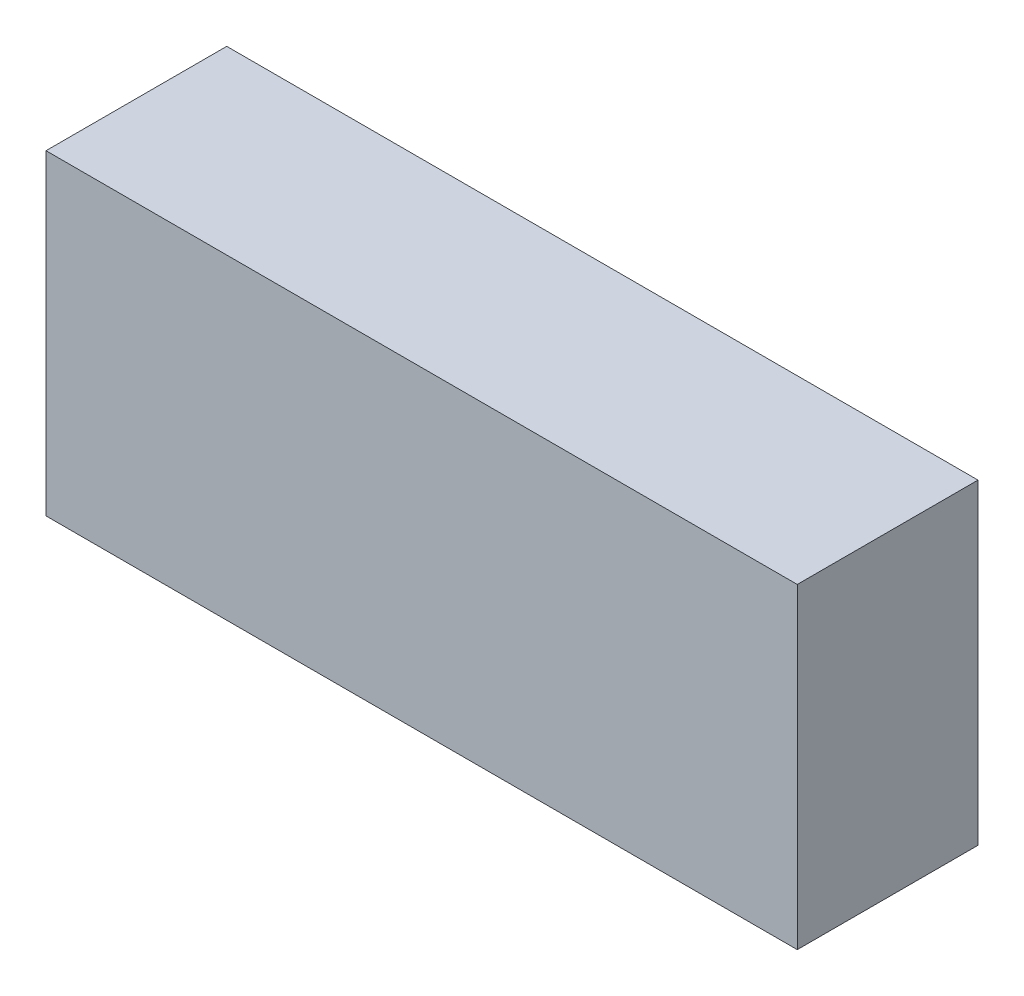
ISO-10303-21;
HEADER;
FILE_DESCRIPTION(('STEP AP214'),'2;1');
FILE_NAME('part.step','',(''),(''),'','','');
FILE_SCHEMA(('AUTOMOTIVE_DESIGN { 1 0 10303 214 1 1 1 1 }'));
ENDSEC;
DATA;
#1=APPLICATION_CONTEXT('core data for automotive mechanical design processes');
#2=APPLICATION_PROTOCOL_DEFINITION('international standard','automotive_design',2000,#1);
#3=PRODUCT_CONTEXT('',#1,'mechanical');
#4=PRODUCT('Part','Part','',(#3));
#5=PRODUCT_RELATED_PRODUCT_CATEGORY('part','',(#4));
#6=PRODUCT_DEFINITION_FORMATION('','',#4);
#7=PRODUCT_DEFINITION_CONTEXT('part definition',#1,'design');
#8=PRODUCT_DEFINITION('design','',#6,#7);
#9=PRODUCT_DEFINITION_SHAPE('','',#8);
#10=(LENGTH_UNIT() NAMED_UNIT(*) SI_UNIT(.MILLI.,.METRE.));
#11=(NAMED_UNIT(*) PLANE_ANGLE_UNIT() SI_UNIT($,.RADIAN.));
#12=(NAMED_UNIT(*) SI_UNIT($,.STERADIAN.) SOLID_ANGLE_UNIT());
#13=UNCERTAINTY_MEASURE_WITH_UNIT(LENGTH_MEASURE(1.E-05),#10,'distance_accuracy_value','');
#14=(GEOMETRIC_REPRESENTATION_CONTEXT(3) GLOBAL_UNCERTAINTY_ASSIGNED_CONTEXT((#13)) GLOBAL_UNIT_ASSIGNED_CONTEXT((#10,
#11,#12)) REPRESENTATION_CONTEXT('',''));
#15=CARTESIAN_POINT('',(0.,0.,0.));
#16=DIRECTION('',(0.,0.,1.));
#17=DIRECTION('',(1.,0.,0.));
#18=AXIS2_PLACEMENT_3D('',#15,#16,#17);
#19=CARTESIAN_POINT('',(-140.,7.,34.7899746413287));
#20=DIRECTION('',(1.,0.,0.));
#21=DIRECTION('',(0.,0.,-1.));
#22=AXIS2_PLACEMENT_3D('',#19,#20,#21);
#23=PLANE('',#22);
#24=DIRECTION('',(0.,0.,1.));
#25=VECTOR('',#24,1.);
#26=CARTESIAN_POINT('',(-140.,0.,34.7899746413287));
#27=LINE('',#26,#25);
#28=CARTESIAN_POINT('',(-140.,0.,34.7899746413287));
#29=VERTEX_POINT('',#28);
#30=CARTESIAN_POINT('',(-140.,0.,38.7899746413287));
#31=VERTEX_POINT('',#30);
#32=EDGE_CURVE('E11',#29,#31,#27,.T.);
#33=ORIENTED_EDGE('',*,*,#32,.T.);
#34=DIRECTION('',(0.,-1.,0.));
#35=VECTOR('',#34,1.);
#36=CARTESIAN_POINT('',(-140.,7.,38.7899746413287));
#37=LINE('',#36,#35);
#38=CARTESIAN_POINT('',(-140.,7.,38.7899746413287));
#39=VERTEX_POINT('',#38);
#40=EDGE_CURVE('E61',#39,#31,#37,.T.);
#41=ORIENTED_EDGE('',*,*,#40,.F.);
#42=DIRECTION('',(0.,0.,1.));
#43=VECTOR('',#42,1.);
#44=CARTESIAN_POINT('',(-140.,7.,34.7899746413287));
#45=LINE('',#44,#43);
#46=CARTESIAN_POINT('',(-140.,7.,34.7899746413287));
#47=VERTEX_POINT('',#46);
#48=EDGE_CURVE('E46',#47,#39,#45,.T.);
#49=ORIENTED_EDGE('',*,*,#48,.F.);
#50=DIRECTION('',(0.,-1.,0.));
#51=VECTOR('',#50,1.);
#52=CARTESIAN_POINT('',(-140.,7.,34.7899746413287));
#53=LINE('',#52,#51);
#54=EDGE_CURVE('E84',#47,#29,#53,.T.);
#55=ORIENTED_EDGE('',*,*,#54,.T.);
#56=EDGE_LOOP('',(#33,#41,#49,#55));
#57=FACE_BOUND('',#56,.T.);
#58=ADVANCED_FACE('F42',(#57),#23,.F.);
#59=CARTESIAN_POINT('',(-123.374044088435,7.,38.7899746413287));
#60=DIRECTION('',(0.,0.,1.));
#61=DIRECTION('',(1.,0.,0.));
#62=AXIS2_PLACEMENT_3D('',#59,#60,#61);
#63=PLANE('',#62);
#64=DIRECTION('',(-1.,0.,0.));
#65=VECTOR('',#64,1.);
#66=CARTESIAN_POINT('',(-123.374044088435,0.,38.7899746413287));
#67=LINE('',#66,#65);
#68=CARTESIAN_POINT('',(-123.374044088435,0.,38.7899746413287));
#69=VERTEX_POINT('',#68);
#70=EDGE_CURVE('E52',#69,#31,#67,.T.);
#71=ORIENTED_EDGE('',*,*,#70,.F.);
#72=DIRECTION('',(0.,-1.,0.));
#73=VECTOR('',#72,1.);
#74=CARTESIAN_POINT('',(-123.374044088435,7.,38.7899746413287));
#75=LINE('',#74,#73);
#76=CARTESIAN_POINT('',(-123.374044088435,7.,38.7899746413287));
#77=VERTEX_POINT('',#76);
#78=EDGE_CURVE('E74',#77,#69,#75,.T.);
#79=ORIENTED_EDGE('',*,*,#78,.F.);
#80=DIRECTION('',(-1.,0.,0.));
#81=VECTOR('',#80,1.);
#82=CARTESIAN_POINT('',(-123.374044088435,7.,38.7899746413287));
#83=LINE('',#82,#81);
#84=EDGE_CURVE('E108',#77,#39,#83,.T.);
#85=ORIENTED_EDGE('',*,*,#84,.T.);
#86=ORIENTED_EDGE('',*,*,#40,.T.);
#87=EDGE_LOOP('',(#71,#79,#85,#86));
#88=FACE_BOUND('',#87,.T.);
#89=ADVANCED_FACE('F114',(#88),#63,.T.);
#90=CARTESIAN_POINT('',(-123.374044088435,7.,34.7899746413287));
#91=DIRECTION('',(1.,0.,0.));
#92=DIRECTION('',(0.,0.,-1.));
#93=AXIS2_PLACEMENT_3D('',#90,#91,#92);
#94=PLANE('',#93);
#95=DIRECTION('',(0.,0.,1.));
#96=VECTOR('',#95,1.);
#97=CARTESIAN_POINT('',(-123.374044088435,0.,34.7899746413287));
#98=LINE('',#97,#96);
#99=CARTESIAN_POINT('',(-123.374044088435,0.,34.7899746413287));
#100=VERTEX_POINT('',#99);
#101=EDGE_CURVE('E101',#100,#69,#98,.T.);
#102=ORIENTED_EDGE('',*,*,#101,.F.);
#103=DIRECTION('',(0.,-1.,0.));
#104=VECTOR('',#103,1.);
#105=CARTESIAN_POINT('',(-123.374044088435,7.,34.7899746413287));
#106=LINE('',#105,#104);
#107=CARTESIAN_POINT('',(-123.374044088435,7.,34.7899746413287));
#108=VERTEX_POINT('',#107);
#109=EDGE_CURVE('E90',#108,#100,#106,.T.);
#110=ORIENTED_EDGE('',*,*,#109,.F.);
#111=DIRECTION('',(0.,0.,1.));
#112=VECTOR('',#111,1.);
#113=CARTESIAN_POINT('',(-123.374044088435,7.,34.7899746413287));
#114=LINE('',#113,#112);
#115=EDGE_CURVE('E113',#108,#77,#114,.T.);
#116=ORIENTED_EDGE('',*,*,#115,.T.);
#117=ORIENTED_EDGE('',*,*,#78,.T.);
#118=EDGE_LOOP('',(#102,#110,#116,#117));
#119=FACE_BOUND('',#118,.T.);
#120=ADVANCED_FACE('F102',(#119),#94,.T.);
#121=CARTESIAN_POINT('',(-140.,7.,34.7899746413287));
#122=DIRECTION('',(0.,0.,-1.));
#123=DIRECTION('',(-1.,0.,0.));
#124=AXIS2_PLACEMENT_3D('',#121,#122,#123);
#125=PLANE('',#124);
#126=DIRECTION('',(1.,0.,0.));
#127=VECTOR('',#126,1.);
#128=CARTESIAN_POINT('',(-140.,0.,34.7899746413287));
#129=LINE('',#128,#127);
#130=EDGE_CURVE('E94',#29,#100,#129,.T.);
#131=ORIENTED_EDGE('',*,*,#130,.F.);
#132=ORIENTED_EDGE('',*,*,#54,.F.);
#133=DIRECTION('',(1.,0.,0.));
#134=VECTOR('',#133,1.);
#135=CARTESIAN_POINT('',(-140.,7.,34.7899746413287));
#136=LINE('',#135,#134);
#137=EDGE_CURVE('E95',#47,#108,#136,.T.);
#138=ORIENTED_EDGE('',*,*,#137,.T.);
#139=ORIENTED_EDGE('',*,*,#109,.T.);
#140=EDGE_LOOP('',(#131,#132,#138,#139));
#141=FACE_BOUND('',#140,.T.);
#142=ADVANCED_FACE('F92',(#141),#125,.T.);
#143=CARTESIAN_POINT('',(0.,7.,0.));
#144=DIRECTION('',(0.,-1.,0.));
#145=DIRECTION('',(0.,0.,-1.));
#146=AXIS2_PLACEMENT_3D('',#143,#144,#145);
#147=PLANE('',#146);
#148=ORIENTED_EDGE('',*,*,#48,.T.);
#149=ORIENTED_EDGE('',*,*,#84,.F.);
#150=ORIENTED_EDGE('',*,*,#115,.F.);
#151=ORIENTED_EDGE('',*,*,#137,.F.);
#152=EDGE_LOOP('',(#148,#149,#150,#151));
#153=FACE_BOUND('',#152,.T.);
#154=ADVANCED_FACE('F44',(#153),#147,.F.);
#155=CARTESIAN_POINT('',(0.,0.,0.));
#156=DIRECTION('',(0.,-1.,0.));
#157=DIRECTION('',(0.,0.,-1.));
#158=AXIS2_PLACEMENT_3D('',#155,#156,#157);
#159=PLANE('',#158);
#160=ORIENTED_EDGE('',*,*,#32,.F.);
#161=ORIENTED_EDGE('',*,*,#130,.T.);
#162=ORIENTED_EDGE('',*,*,#101,.T.);
#163=ORIENTED_EDGE('',*,*,#70,.T.);
#164=EDGE_LOOP('',(#160,#161,#162,#163));
#165=FACE_BOUND('',#164,.T.);
#166=ADVANCED_FACE('F106',(#165),#159,.T.);
#167=CLOSED_SHELL('',(#58,#89,#120,#142,#154,#166));
#168=MANIFOLD_SOLID_BREP('B2',#167);
#169=ADVANCED_BREP_SHAPE_REPRESENTATION('',(#18,#168),#14);
#170=SHAPE_DEFINITION_REPRESENTATION(#9,#169);
ENDSEC;
END-ISO-10303-21;
